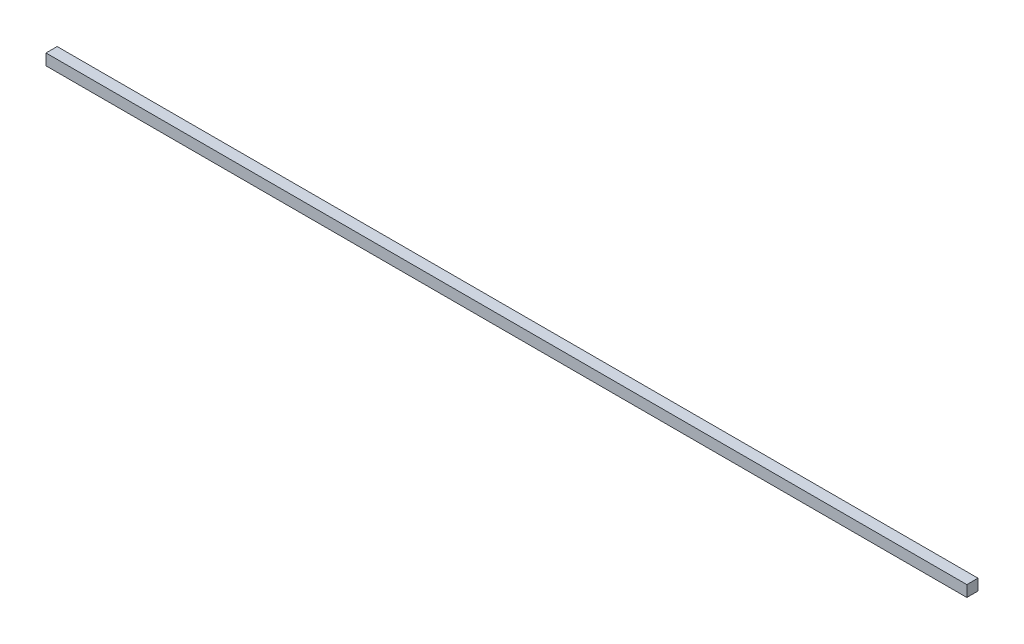
ISO-10303-21;
HEADER;
FILE_DESCRIPTION(('STEP AP214'),'2;1');
FILE_NAME('part.step','',(''),(''),'','','');
FILE_SCHEMA(('AUTOMOTIVE_DESIGN { 1 0 10303 214 1 1 1 1 }'));
ENDSEC;
DATA;
#1=APPLICATION_CONTEXT('core data for automotive mechanical design processes');
#2=APPLICATION_PROTOCOL_DEFINITION('international standard','automotive_design',2000,#1);
#3=PRODUCT_CONTEXT('',#1,'mechanical');
#4=PRODUCT('Part','Part','',(#3));
#5=PRODUCT_RELATED_PRODUCT_CATEGORY('part','',(#4));
#6=PRODUCT_DEFINITION_FORMATION('','',#4);
#7=PRODUCT_DEFINITION_CONTEXT('part definition',#1,'design');
#8=PRODUCT_DEFINITION('design','',#6,#7);
#9=PRODUCT_DEFINITION_SHAPE('','',#8);
#10=(LENGTH_UNIT() NAMED_UNIT(*) SI_UNIT(.MILLI.,.METRE.));
#11=(NAMED_UNIT(*) PLANE_ANGLE_UNIT() SI_UNIT($,.RADIAN.));
#12=(NAMED_UNIT(*) SI_UNIT($,.STERADIAN.) SOLID_ANGLE_UNIT());
#13=UNCERTAINTY_MEASURE_WITH_UNIT(LENGTH_MEASURE(1.E-05),#10,'distance_accuracy_value','');
#14=(GEOMETRIC_REPRESENTATION_CONTEXT(3) GLOBAL_UNCERTAINTY_ASSIGNED_CONTEXT((#13)) GLOBAL_UNIT_ASSIGNED_CONTEXT((#10,
#11,#12)) REPRESENTATION_CONTEXT('',''));
#15=CARTESIAN_POINT('',(0.,0.,0.));
#16=DIRECTION('',(0.,0.,1.));
#17=DIRECTION('',(1.,0.,0.));
#18=AXIS2_PLACEMENT_3D('',#15,#16,#17);
#19=CARTESIAN_POINT('',(20.,1152.,30.));
#20=DIRECTION('',(1.,0.,0.));
#21=DIRECTION('',(0.,0.,-1.));
#22=AXIS2_PLACEMENT_3D('',#19,#20,#21);
#23=PLANE('',#22);
#24=DIRECTION('',(0.,-1.,0.));
#25=VECTOR('',#24,1.);
#26=CARTESIAN_POINT('',(20.,1152.,22.));
#27=LINE('',#26,#25);
#28=CARTESIAN_POINT('',(20.,1160.,22.));
#29=VERTEX_POINT('',#28);
#30=CARTESIAN_POINT('',(20.,1152.,22.));
#31=VERTEX_POINT('',#30);
#32=EDGE_CURVE('E102',#29,#31,#27,.T.);
#33=ORIENTED_EDGE('',*,*,#32,.T.);
#34=DIRECTION('',(0.,0.,-1.));
#35=VECTOR('',#34,1.);
#36=CARTESIAN_POINT('',(20.,1152.,30.));
#37=LINE('',#36,#35);
#38=CARTESIAN_POINT('',(20.,1152.,30.));
#39=VERTEX_POINT('',#38);
#40=EDGE_CURVE('E11',#39,#31,#37,.T.);
#41=ORIENTED_EDGE('',*,*,#40,.F.);
#42=DIRECTION('',(0.,-1.,0.));
#43=VECTOR('',#42,1.);
#44=CARTESIAN_POINT('',(20.,1152.,30.));
#45=LINE('',#44,#43);
#46=CARTESIAN_POINT('',(20.,1160.,30.));
#47=VERTEX_POINT('',#46);
#48=EDGE_CURVE('E90',#47,#39,#45,.T.);
#49=ORIENTED_EDGE('',*,*,#48,.F.);
#50=DIRECTION('',(0.,0.,-1.));
#51=VECTOR('',#50,1.);
#52=CARTESIAN_POINT('',(20.,1160.,30.));
#53=LINE('',#52,#51);
#54=EDGE_CURVE('E98',#47,#29,#53,.T.);
#55=ORIENTED_EDGE('',*,*,#54,.T.);
#56=EDGE_LOOP('',(#33,#41,#49,#55));
#57=FACE_BOUND('',#56,.T.);
#58=ADVANCED_FACE('F39',(#57),#23,.F.);
#59=CARTESIAN_POINT('',(20.,1152.,30.));
#60=DIRECTION('',(0.,1.,0.));
#61=DIRECTION('',(0.,0.,1.));
#62=AXIS2_PLACEMENT_3D('',#59,#60,#61);
#63=PLANE('',#62);
#64=DIRECTION('',(1.,0.,0.));
#65=VECTOR('',#64,1.);
#66=CARTESIAN_POINT('',(20.,1152.,22.));
#67=LINE('',#66,#65);
#68=CARTESIAN_POINT('',(680.,1152.,22.));
#69=VERTEX_POINT('',#68);
#70=EDGE_CURVE('E94',#31,#69,#67,.T.);
#71=ORIENTED_EDGE('',*,*,#70,.T.);
#72=DIRECTION('',(0.,0.,-1.));
#73=VECTOR('',#72,1.);
#74=CARTESIAN_POINT('',(680.,1152.,30.));
#75=LINE('',#74,#73);
#76=CARTESIAN_POINT('',(680.,1152.,30.));
#77=VERTEX_POINT('',#76);
#78=EDGE_CURVE('E47',#77,#69,#75,.T.);
#79=ORIENTED_EDGE('',*,*,#78,.F.);
#80=DIRECTION('',(1.,0.,0.));
#81=VECTOR('',#80,1.);
#82=CARTESIAN_POINT('',(20.,1152.,30.));
#83=LINE('',#82,#81);
#84=EDGE_CURVE('E85',#39,#77,#83,.T.);
#85=ORIENTED_EDGE('',*,*,#84,.F.);
#86=ORIENTED_EDGE('',*,*,#40,.T.);
#87=EDGE_LOOP('',(#71,#79,#85,#86));
#88=FACE_BOUND('',#87,.T.);
#89=ADVANCED_FACE('F93',(#88),#63,.F.);
#90=CARTESIAN_POINT('',(680.,1152.,30.));
#91=DIRECTION('',(-1.,0.,0.));
#92=DIRECTION('',(0.,0.,1.));
#93=AXIS2_PLACEMENT_3D('',#90,#91,#92);
#94=PLANE('',#93);
#95=DIRECTION('',(0.,1.,0.));
#96=VECTOR('',#95,1.);
#97=CARTESIAN_POINT('',(680.,1152.,22.));
#98=LINE('',#97,#96);
#99=CARTESIAN_POINT('',(680.,1160.,22.));
#100=VERTEX_POINT('',#99);
#101=EDGE_CURVE('E72',#69,#100,#98,.T.);
#102=ORIENTED_EDGE('',*,*,#101,.T.);
#103=DIRECTION('',(0.,0.,-1.));
#104=VECTOR('',#103,1.);
#105=CARTESIAN_POINT('',(680.,1160.,30.));
#106=LINE('',#105,#104);
#107=CARTESIAN_POINT('',(680.,1160.,30.));
#108=VERTEX_POINT('',#107);
#109=EDGE_CURVE('E95',#108,#100,#106,.T.);
#110=ORIENTED_EDGE('',*,*,#109,.F.);
#111=DIRECTION('',(0.,1.,0.));
#112=VECTOR('',#111,1.);
#113=CARTESIAN_POINT('',(680.,1152.,30.));
#114=LINE('',#113,#112);
#115=EDGE_CURVE('E88',#77,#108,#114,.T.);
#116=ORIENTED_EDGE('',*,*,#115,.F.);
#117=ORIENTED_EDGE('',*,*,#78,.T.);
#118=EDGE_LOOP('',(#102,#110,#116,#117));
#119=FACE_BOUND('',#118,.T.);
#120=ADVANCED_FACE('F96',(#119),#94,.F.);
#121=CARTESIAN_POINT('',(20.,1160.,30.));
#122=DIRECTION('',(0.,-1.,0.));
#123=DIRECTION('',(0.,0.,-1.));
#124=AXIS2_PLACEMENT_3D('',#121,#122,#123);
#125=PLANE('',#124);
#126=DIRECTION('',(-1.,0.,0.));
#127=VECTOR('',#126,1.);
#128=CARTESIAN_POINT('',(20.,1160.,22.));
#129=LINE('',#128,#127);
#130=EDGE_CURVE('E78',#100,#29,#129,.T.);
#131=ORIENTED_EDGE('',*,*,#130,.T.);
#132=ORIENTED_EDGE('',*,*,#54,.F.);
#133=DIRECTION('',(-1.,0.,0.));
#134=VECTOR('',#133,1.);
#135=CARTESIAN_POINT('',(20.,1160.,30.));
#136=LINE('',#135,#134);
#137=EDGE_CURVE('E55',#108,#47,#136,.T.);
#138=ORIENTED_EDGE('',*,*,#137,.F.);
#139=ORIENTED_EDGE('',*,*,#109,.T.);
#140=EDGE_LOOP('',(#131,#132,#138,#139));
#141=FACE_BOUND('',#140,.T.);
#142=ADVANCED_FACE('F109',(#141),#125,.F.);
#143=CARTESIAN_POINT('',(0.,0.,30.));
#144=DIRECTION('',(0.,0.,-1.));
#145=DIRECTION('',(-1.,0.,0.));
#146=AXIS2_PLACEMENT_3D('',#143,#144,#145);
#147=PLANE('',#146);
#148=ORIENTED_EDGE('',*,*,#48,.T.);
#149=ORIENTED_EDGE('',*,*,#84,.T.);
#150=ORIENTED_EDGE('',*,*,#115,.T.);
#151=ORIENTED_EDGE('',*,*,#137,.T.);
#152=EDGE_LOOP('',(#148,#149,#150,#151));
#153=FACE_BOUND('',#152,.T.);
#154=ADVANCED_FACE('F86',(#153),#147,.F.);
#155=CARTESIAN_POINT('',(0.,0.,22.));
#156=DIRECTION('',(0.,0.,-1.));
#157=DIRECTION('',(-1.,0.,0.));
#158=AXIS2_PLACEMENT_3D('',#155,#156,#157);
#159=PLANE('',#158);
#160=ORIENTED_EDGE('',*,*,#32,.F.);
#161=ORIENTED_EDGE('',*,*,#130,.F.);
#162=ORIENTED_EDGE('',*,*,#101,.F.);
#163=ORIENTED_EDGE('',*,*,#70,.F.);
#164=EDGE_LOOP('',(#160,#161,#162,#163));
#165=FACE_BOUND('',#164,.T.);
#166=ADVANCED_FACE('F112',(#165),#159,.T.);
#167=CLOSED_SHELL('',(#58,#89,#120,#142,#154,#166));
#168=MANIFOLD_SOLID_BREP('B2',#167);
#169=ADVANCED_BREP_SHAPE_REPRESENTATION('',(#18,#168),#14);
#170=SHAPE_DEFINITION_REPRESENTATION(#9,#169);
ENDSEC;
END-ISO-10303-21;
